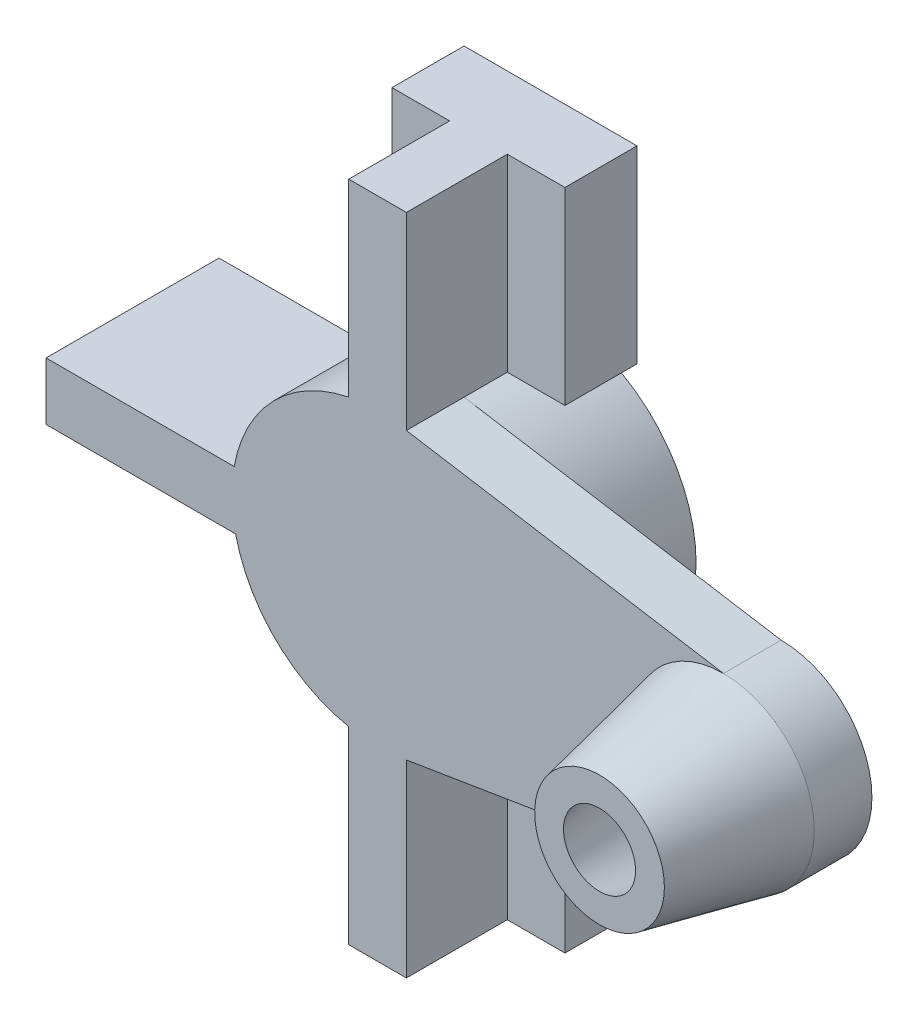
ISO-10303-21;
HEADER;
FILE_DESCRIPTION(('STEP AP214'),'2;1');
FILE_NAME('part.step','',(''),(''),'','','');
FILE_SCHEMA(('AUTOMOTIVE_DESIGN { 1 0 10303 214 1 1 1 1 }'));
ENDSEC;
DATA;
#1=APPLICATION_CONTEXT('core data for automotive mechanical design processes');
#2=APPLICATION_PROTOCOL_DEFINITION('international standard','automotive_design',2000,#1);
#3=PRODUCT_CONTEXT('',#1,'mechanical');
#4=PRODUCT('Part','Part','',(#3));
#5=PRODUCT_RELATED_PRODUCT_CATEGORY('part','',(#4));
#6=PRODUCT_DEFINITION_FORMATION('','',#4);
#7=PRODUCT_DEFINITION_CONTEXT('part definition',#1,'design');
#8=PRODUCT_DEFINITION('design','',#6,#7);
#9=PRODUCT_DEFINITION_SHAPE('','',#8);
#10=(LENGTH_UNIT() NAMED_UNIT(*) SI_UNIT(.MILLI.,.METRE.));
#11=(NAMED_UNIT(*) PLANE_ANGLE_UNIT() SI_UNIT($,.RADIAN.));
#12=(NAMED_UNIT(*) SI_UNIT($,.STERADIAN.) SOLID_ANGLE_UNIT());
#13=UNCERTAINTY_MEASURE_WITH_UNIT(LENGTH_MEASURE(1.E-05),#10,'distance_accuracy_value','');
#14=(GEOMETRIC_REPRESENTATION_CONTEXT(3) GLOBAL_UNCERTAINTY_ASSIGNED_CONTEXT((#13)) GLOBAL_UNIT_ASSIGNED_CONTEXT((#10,
#11,#12)) REPRESENTATION_CONTEXT('',''));
#15=CARTESIAN_POINT('',(0.,0.,0.));
#16=DIRECTION('',(0.,0.,1.));
#17=DIRECTION('',(1.,0.,0.));
#18=AXIS2_PLACEMENT_3D('',#15,#16,#17);
#19=CARTESIAN_POINT('',(-10.,-115.,20.));
#20=DIRECTION('',(1.,0.,0.));
#21=DIRECTION('',(0.,1.,0.));
#22=AXIS2_PLACEMENT_3D('',#19,#20,#21);
#23=PLANE('',#22);
#24=DIRECTION('',(0.,1.,0.));
#25=VECTOR('',#24,1.);
#26=CARTESIAN_POINT('',(-10.,-115.,-15.));
#27=LINE('',#26,#25);
#28=CARTESIAN_POINT('',(-10.,-115.,-15.));
#29=VERTEX_POINT('',#28);
#30=CARTESIAN_POINT('',(-10.,-49.5,-15.));
#31=VERTEX_POINT('',#30);
#32=EDGE_CURVE('E253',#29,#31,#27,.T.);
#33=ORIENTED_EDGE('',*,*,#32,.F.);
#34=DIRECTION('',(0.,0.,-1.));
#35=VECTOR('',#34,1.);
#36=CARTESIAN_POINT('',(-10.,-115.,20.));
#37=LINE('',#36,#35);
#38=CARTESIAN_POINT('',(-10.,-115.,20.));
#39=VERTEX_POINT('',#38);
#40=EDGE_CURVE('E380',#39,#29,#37,.T.);
#41=ORIENTED_EDGE('',*,*,#40,.F.);
#42=DIRECTION('',(0.,-1.,0.));
#43=VECTOR('',#42,1.);
#44=CARTESIAN_POINT('',(-10.,-115.,20.));
#45=LINE('',#44,#43);
#46=CARTESIAN_POINT('',(-9.99999999999999,-49.5,20.));
#47=VERTEX_POINT('',#46);
#48=EDGE_CURVE('E468',#47,#39,#45,.T.);
#49=ORIENTED_EDGE('',*,*,#48,.F.);
#50=DIRECTION('',(0.,0.,-1.));
#51=VECTOR('',#50,1.);
#52=CARTESIAN_POINT('',(-9.99999999999999,-49.5,20.));
#53=LINE('',#52,#51);
#54=EDGE_CURVE('E375',#47,#31,#53,.T.);
#55=ORIENTED_EDGE('',*,*,#54,.T.);
#56=EDGE_LOOP('',(#33,#41,#49,#55));
#57=FACE_BOUND('',#56,.T.);
#58=ADVANCED_FACE('F33',(#57),#23,.F.);
#59=CARTESIAN_POINT('',(10.,-115.,20.));
#60=DIRECTION('',(-1.,0.,0.));
#61=DIRECTION('',(0.,-1.,0.));
#62=AXIS2_PLACEMENT_3D('',#59,#60,#61);
#63=PLANE('',#62);
#64=DIRECTION('',(0.,-1.,0.));
#65=VECTOR('',#64,1.);
#66=CARTESIAN_POINT('',(10.,-115.,-15.));
#67=LINE('',#66,#65);
#68=CARTESIAN_POINT('',(10.,-49.5,-15.));
#69=VERTEX_POINT('',#68);
#70=CARTESIAN_POINT('',(10.,-115.,-15.));
#71=VERTEX_POINT('',#70);
#72=EDGE_CURVE('E11',#69,#71,#67,.T.);
#73=ORIENTED_EDGE('',*,*,#72,.F.);
#74=DIRECTION('',(0.,0.,1.));
#75=VECTOR('',#74,1.);
#76=CARTESIAN_POINT('',(10.,-49.5,-40.));
#77=LINE('',#76,#75);
#78=CARTESIAN_POINT('',(10.,-49.5,0.));
#79=VERTEX_POINT('',#78);
#80=EDGE_CURVE('E308',#69,#79,#77,.T.);
#81=ORIENTED_EDGE('',*,*,#80,.T.);
#82=DIRECTION('',(0.,0.,-1.));
#83=VECTOR('',#82,1.);
#84=CARTESIAN_POINT('',(10.,-49.5,20.));
#85=LINE('',#84,#83);
#86=CARTESIAN_POINT('',(10.,-49.5,20.));
#87=VERTEX_POINT('',#86);
#88=EDGE_CURVE('E361',#87,#79,#85,.T.);
#89=ORIENTED_EDGE('',*,*,#88,.F.);
#90=DIRECTION('',(0.,1.,0.));
#91=VECTOR('',#90,1.);
#92=CARTESIAN_POINT('',(10.,-115.,20.));
#93=LINE('',#92,#91);
#94=CARTESIAN_POINT('',(10.,-115.,20.));
#95=VERTEX_POINT('',#94);
#96=EDGE_CURVE('E356',#95,#87,#93,.T.);
#97=ORIENTED_EDGE('',*,*,#96,.F.);
#98=DIRECTION('',(0.,0.,-1.));
#99=VECTOR('',#98,1.);
#100=CARTESIAN_POINT('',(10.,-115.,20.));
#101=LINE('',#100,#99);
#102=EDGE_CURVE('E411',#95,#71,#101,.T.);
#103=ORIENTED_EDGE('',*,*,#102,.T.);
#104=EDGE_LOOP('',(#73,#81,#89,#97,#103));
#105=FACE_BOUND('',#104,.T.);
#106=ADVANCED_FACE('F438',(#105),#63,.F.);
#107=CARTESIAN_POINT('',(0.,0.,20.));
#108=DIRECTION('',(0.,0.,-1.));
#109=DIRECTION('',(-1.,0.,0.));
#110=AXIS2_PLACEMENT_3D('',#107,#108,#109);
#111=CYLINDRICAL_SURFACE('',#110,50.5);
#112=DIRECTION('',(0.,0.,-1.));
#113=VECTOR('',#112,1.);
#114=CARTESIAN_POINT('',(-49.2399718251623,-11.2104939524189,20.));
#115=LINE('',#114,#113);
#116=CARTESIAN_POINT('',(-49.2399718251623,-11.2104939524189,20.));
#117=VERTEX_POINT('',#116);
#118=CARTESIAN_POINT('',(-49.2399718251623,-11.2104939524189,-40.));
#119=VERTEX_POINT('',#118);
#120=EDGE_CURVE('E372',#117,#119,#115,.T.);
#121=ORIENTED_EDGE('',*,*,#120,.T.);
#122=CARTESIAN_POINT('',(0.,0.,-40.));
#123=DIRECTION('',(0.,0.,-1.));
#124=DIRECTION('',(-1.,0.,0.));
#125=AXIS2_PLACEMENT_3D('',#122,#123,#124);
#126=CIRCLE('',#125,50.5);
#127=CARTESIAN_POINT('',(-9.99999999999997,-49.5,-40.));
#128=VERTEX_POINT('',#127);
#129=EDGE_CURVE('E312',#128,#119,#126,.T.);
#130=ORIENTED_EDGE('',*,*,#129,.F.);
#131=DIRECTION('',(0.,0.,1.));
#132=VECTOR('',#131,1.);
#133=CARTESIAN_POINT('',(-9.99999999999999,-49.5,20.));
#134=LINE('',#133,#132);
#135=EDGE_CURVE('E247',#128,#31,#134,.T.);
#136=ORIENTED_EDGE('',*,*,#135,.T.);
#137=ORIENTED_EDGE('',*,*,#54,.F.);
#138=CARTESIAN_POINT('',(0.,0.,20.));
#139=DIRECTION('',(0.,0.,1.));
#140=DIRECTION('',(1.,0.,0.));
#141=AXIS2_PLACEMENT_3D('',#138,#139,#140);
#142=CIRCLE('',#141,50.5);
#143=EDGE_CURVE('E466',#117,#47,#142,.T.);
#144=ORIENTED_EDGE('',*,*,#143,.F.);
#145=EDGE_LOOP('',(#121,#130,#136,#137,#144));
#146=FACE_BOUND('',#145,.T.);
#147=ADVANCED_FACE('F444',(#146),#111,.T.);
#148=CARTESIAN_POINT('',(-49.729212576106,8.78950604758113,-40.));
#149=VERTEX_POINT('',#148);
#150=CARTESIAN_POINT('',(-10.,49.5,-40.));
#151=VERTEX_POINT('',#150);
#152=EDGE_CURVE('E316',#149,#151,#126,.T.);
#153=ORIENTED_EDGE('',*,*,#152,.F.);
#154=DIRECTION('',(0.,0.,-1.));
#155=VECTOR('',#154,1.);
#156=CARTESIAN_POINT('',(-49.729212576106,8.78950604758113,20.));
#157=LINE('',#156,#155);
#158=CARTESIAN_POINT('',(-49.729212576106,8.78950604758113,20.));
#159=VERTEX_POINT('',#158);
#160=EDGE_CURVE('E48',#159,#149,#157,.T.);
#161=ORIENTED_EDGE('',*,*,#160,.F.);
#162=CARTESIAN_POINT('',(0.,0.,20.));
#163=DIRECTION('',(0.,0.,1.));
#164=DIRECTION('',(1.,0.,0.));
#165=AXIS2_PLACEMENT_3D('',#162,#163,#164);
#166=CIRCLE('',#165,50.5);
#167=CARTESIAN_POINT('',(-9.99999999999999,49.5,20.));
#168=VERTEX_POINT('',#167);
#169=EDGE_CURVE('E487',#168,#159,#166,.T.);
#170=ORIENTED_EDGE('',*,*,#169,.F.);
#171=DIRECTION('',(0.,0.,-1.));
#172=VECTOR('',#171,1.);
#173=CARTESIAN_POINT('',(-9.99999999999999,49.5,20.));
#174=LINE('',#173,#172);
#175=CARTESIAN_POINT('',(-10.,49.5,-15.));
#176=VERTEX_POINT('',#175);
#177=EDGE_CURVE('E368',#168,#176,#174,.T.);
#178=ORIENTED_EDGE('',*,*,#177,.T.);
#179=DIRECTION('',(0.,0.,-1.));
#180=VECTOR('',#179,1.);
#181=CARTESIAN_POINT('',(-9.99999999999999,49.5,20.));
#182=LINE('',#181,#180);
#183=EDGE_CURVE('E280',#176,#151,#182,.T.);
#184=ORIENTED_EDGE('',*,*,#183,.T.);
#185=EDGE_LOOP('',(#153,#161,#170,#178,#184));
#186=FACE_BOUND('',#185,.T.);
#187=ADVANCED_FACE('F452',(#186),#111,.T.);
#188=DIRECTION('',(0.,0.,1.));
#189=VECTOR('',#188,1.);
#190=CARTESIAN_POINT('',(10.,49.5,-40.));
#191=LINE('',#190,#189);
#192=CARTESIAN_POINT('',(10.,49.5,-40.));
#193=VERTEX_POINT('',#192);
#194=CARTESIAN_POINT('',(10.,49.5,-15.));
#195=VERTEX_POINT('',#194);
#196=EDGE_CURVE('E304',#193,#195,#191,.T.);
#197=ORIENTED_EDGE('',*,*,#196,.T.);
#198=CARTESIAN_POINT('',(10.,49.5,0.));
#199=VERTEX_POINT('',#198);
#200=EDGE_CURVE('E303',#195,#199,#191,.T.);
#201=ORIENTED_EDGE('',*,*,#200,.T.);
#202=CARTESIAN_POINT('',(0.,0.,0.));
#203=DIRECTION('',(0.,0.,-1.));
#204=DIRECTION('',(-1.,0.,0.));
#205=AXIS2_PLACEMENT_3D('',#202,#203,#204);
#206=CIRCLE('',#205,50.5);
#207=EDGE_CURVE('E364',#199,#79,#206,.T.);
#208=ORIENTED_EDGE('',*,*,#207,.T.);
#209=ORIENTED_EDGE('',*,*,#80,.F.);
#210=CARTESIAN_POINT('',(10.,-49.5,-40.));
#211=VERTEX_POINT('',#210);
#212=EDGE_CURVE('E309',#211,#69,#77,.T.);
#213=ORIENTED_EDGE('',*,*,#212,.F.);
#214=EDGE_CURVE('E311',#193,#211,#126,.T.);
#215=ORIENTED_EDGE('',*,*,#214,.F.);
#216=EDGE_LOOP('',(#197,#201,#208,#209,#213,#215));
#217=FACE_BOUND('',#216,.T.);
#218=ADVANCED_FACE('F454',(#217),#111,.T.);
#219=CARTESIAN_POINT('',(120.,0.,0.));
#220=DIRECTION('',(0.,0.,1.));
#221=DIRECTION('',(1.,0.,0.));
#222=AXIS2_PLACEMENT_3D('',#219,#220,#221);
#223=PLANE('',#222);
#224=ORIENTED_EDGE('',*,*,#207,.F.);
#225=DIRECTION('',(-0.98687458289775,0.161488568110541,0.));
#226=VECTOR('',#225,1.);
#227=CARTESIAN_POINT('',(120.,31.5,0.));
#228=LINE('',#227,#226);
#229=CARTESIAN_POINT('',(120.,31.5,0.));
#230=VERTEX_POINT('',#229);
#231=EDGE_CURVE('E406',#230,#199,#228,.T.);
#232=ORIENTED_EDGE('',*,*,#231,.F.);
#233=CARTESIAN_POINT('',(120.,0.,0.));
#234=DIRECTION('',(0.,0.,1.));
#235=DIRECTION('',(1.,0.,0.));
#236=AXIS2_PLACEMENT_3D('',#233,#234,#235);
#237=CIRCLE('',#236,31.5);
#238=CARTESIAN_POINT('',(120.,-31.5,0.));
#239=VERTEX_POINT('',#238);
#240=EDGE_CURVE('E478',#239,#230,#237,.T.);
#241=ORIENTED_EDGE('',*,*,#240,.F.);
#242=DIRECTION('',(0.98687458289775,0.161488568110541,0.));
#243=VECTOR('',#242,1.);
#244=CARTESIAN_POINT('',(120.,-31.5,0.));
#245=LINE('',#244,#243);
#246=EDGE_CURVE('E329',#79,#239,#245,.T.);
#247=ORIENTED_EDGE('',*,*,#246,.F.);
#248=EDGE_LOOP('',(#224,#232,#241,#247));
#249=FACE_BOUND('',#248,.T.);
#250=ADVANCED_FACE('F564',(#249),#223,.F.);
#251=CARTESIAN_POINT('',(142.5,0.,63.));
#252=DIRECTION('',(0.,0.,1.));
#253=DIRECTION('',(1.,0.,0.));
#254=AXIS2_PLACEMENT_3D('',#251,#252,#253);
#255=PLANE('',#254);
#256=CARTESIAN_POINT('',(120.,0.,63.));
#257=DIRECTION('',(0.,0.,1.));
#258=DIRECTION('',(1.,0.,0.));
#259=AXIS2_PLACEMENT_3D('',#256,#257,#258);
#260=CIRCLE('',#259,22.5);
#261=CARTESIAN_POINT('',(142.5,0.,63.));
#262=VERTEX_POINT('',#261);
#263=EDGE_CURVE('E322',#262,#262,#260,.T.);
#264=ORIENTED_EDGE('',*,*,#263,.T.);
#265=EDGE_LOOP('',(#264));
#266=FACE_BOUND('',#265,.T.);
#267=CARTESIAN_POINT('',(120.,0.,63.));
#268=DIRECTION('',(0.,0.,-1.));
#269=DIRECTION('',(-1.,0.,0.));
#270=AXIS2_PLACEMENT_3D('',#267,#268,#269);
#271=CIRCLE('',#270,12.5);
#272=CARTESIAN_POINT('',(107.5,0.,63.));
#273=VERTEX_POINT('',#272);
#274=EDGE_CURVE('E319',#273,#273,#271,.T.);
#275=ORIENTED_EDGE('',*,*,#274,.T.);
#276=EDGE_LOOP('',(#275));
#277=FACE_BOUND('',#276,.T.);
#278=ADVANCED_FACE('F561',(#266,#277),#255,.T.);
#279=CARTESIAN_POINT('',(-10.,115.,20.));
#280=DIRECTION('',(0.,-1.,0.));
#281=DIRECTION('',(1.,0.,0.));
#282=AXIS2_PLACEMENT_3D('',#279,#280,#281);
#283=PLANE('',#282);
#284=DIRECTION('',(0.,0.,-1.));
#285=VECTOR('',#284,1.);
#286=CARTESIAN_POINT('',(10.,115.,20.));
#287=LINE('',#286,#285);
#288=CARTESIAN_POINT('',(10.,115.,20.));
#289=VERTEX_POINT('',#288);
#290=CARTESIAN_POINT('',(10.,115.,-15.));
#291=VERTEX_POINT('',#290);
#292=EDGE_CURVE('E393',#289,#291,#287,.T.);
#293=ORIENTED_EDGE('',*,*,#292,.T.);
#294=DIRECTION('',(1.,0.,0.));
#295=VECTOR('',#294,1.);
#296=CARTESIAN_POINT('',(30.,115.,-15.));
#297=LINE('',#296,#295);
#298=CARTESIAN_POINT('',(30.,115.,-15.));
#299=VERTEX_POINT('',#298);
#300=EDGE_CURVE('E259',#291,#299,#297,.T.);
#301=ORIENTED_EDGE('',*,*,#300,.T.);
#302=DIRECTION('',(0.,0.,-1.));
#303=VECTOR('',#302,1.);
#304=CARTESIAN_POINT('',(30.,115.,-15.));
#305=LINE('',#304,#303);
#306=CARTESIAN_POINT('',(30.,115.,-40.));
#307=VERTEX_POINT('',#306);
#308=EDGE_CURVE('E283',#299,#307,#305,.T.);
#309=ORIENTED_EDGE('',*,*,#308,.T.);
#310=DIRECTION('',(1.,0.,0.));
#311=VECTOR('',#310,1.);
#312=CARTESIAN_POINT('',(-10.,115.,-40.));
#313=LINE('',#312,#311);
#314=CARTESIAN_POINT('',(-30.,115.,-40.));
#315=VERTEX_POINT('',#314);
#316=EDGE_CURVE('E301',#315,#307,#313,.T.);
#317=ORIENTED_EDGE('',*,*,#316,.F.);
#318=DIRECTION('',(0.,0.,-1.));
#319=VECTOR('',#318,1.);
#320=CARTESIAN_POINT('',(-30.,115.,-15.));
#321=LINE('',#320,#319);
#322=CARTESIAN_POINT('',(-30.,115.,-15.));
#323=VERTEX_POINT('',#322);
#324=EDGE_CURVE('E270',#323,#315,#321,.T.);
#325=ORIENTED_EDGE('',*,*,#324,.F.);
#326=CARTESIAN_POINT('',(-10.,115.,-15.));
#327=VERTEX_POINT('',#326);
#328=EDGE_CURVE('E260',#323,#327,#297,.T.);
#329=ORIENTED_EDGE('',*,*,#328,.T.);
#330=DIRECTION('',(0.,0.,-1.));
#331=VECTOR('',#330,1.);
#332=CARTESIAN_POINT('',(-10.,115.,20.));
#333=LINE('',#332,#331);
#334=CARTESIAN_POINT('',(-10.,115.,20.));
#335=VERTEX_POINT('',#334);
#336=EDGE_CURVE('E335',#335,#327,#333,.T.);
#337=ORIENTED_EDGE('',*,*,#336,.F.);
#338=DIRECTION('',(-1.,0.,0.));
#339=VECTOR('',#338,1.);
#340=CARTESIAN_POINT('',(-10.,115.,20.));
#341=LINE('',#340,#339);
#342=EDGE_CURVE('E330',#289,#335,#341,.T.);
#343=ORIENTED_EDGE('',*,*,#342,.F.);
#344=EDGE_LOOP('',(#293,#301,#309,#317,#325,#329,#337,#343));
#345=FACE_BOUND('',#344,.T.);
#346=ADVANCED_FACE('F35',(#345),#283,.F.);
#347=CARTESIAN_POINT('',(-10.,115.,20.));
#348=DIRECTION('',(1.,0.,0.));
#349=DIRECTION('',(0.,1.,0.));
#350=AXIS2_PLACEMENT_3D('',#347,#348,#349);
#351=PLANE('',#350);
#352=ORIENTED_EDGE('',*,*,#336,.T.);
#353=DIRECTION('',(0.,-1.,0.));
#354=VECTOR('',#353,1.);
#355=CARTESIAN_POINT('',(-10.,115.,-15.));
#356=LINE('',#355,#354);
#357=EDGE_CURVE('E290',#327,#176,#356,.T.);
#358=ORIENTED_EDGE('',*,*,#357,.T.);
#359=ORIENTED_EDGE('',*,*,#177,.F.);
#360=DIRECTION('',(0.,-1.,0.));
#361=VECTOR('',#360,1.);
#362=CARTESIAN_POINT('',(-10.,115.,20.));
#363=LINE('',#362,#361);
#364=EDGE_CURVE('E486',#335,#168,#363,.T.);
#365=ORIENTED_EDGE('',*,*,#364,.F.);
#366=EDGE_LOOP('',(#352,#358,#359,#365));
#367=FACE_BOUND('',#366,.T.);
#368=ADVANCED_FACE('F428',(#367),#351,.F.);
#369=CARTESIAN_POINT('',(-115.,8.78950604758114,20.));
#370=DIRECTION('',(0.,-1.,0.));
#371=DIRECTION('',(0.,0.,-1.));
#372=AXIS2_PLACEMENT_3D('',#369,#370,#371);
#373=PLANE('',#372);
#374=ORIENTED_EDGE('',*,*,#160,.T.);
#375=DIRECTION('',(1.,0.,0.));
#376=VECTOR('',#375,1.);
#377=CARTESIAN_POINT('',(-115.,8.78950604758114,-40.));
#378=LINE('',#377,#376);
#379=CARTESIAN_POINT('',(-115.,8.78950604758114,-40.));
#380=VERTEX_POINT('',#379);
#381=EDGE_CURVE('E299',#380,#149,#378,.T.);
#382=ORIENTED_EDGE('',*,*,#381,.F.);
#383=DIRECTION('',(0.,0.,-1.));
#384=VECTOR('',#383,1.);
#385=CARTESIAN_POINT('',(-115.,8.78950604758114,20.));
#386=LINE('',#385,#384);
#387=CARTESIAN_POINT('',(-115.,8.78950604758114,20.));
#388=VERTEX_POINT('',#387);
#389=EDGE_CURVE('E369',#388,#380,#386,.T.);
#390=ORIENTED_EDGE('',*,*,#389,.F.);
#391=DIRECTION('',(-1.,0.,0.));
#392=VECTOR('',#391,1.);
#393=CARTESIAN_POINT('',(-115.,8.78950604758114,20.));
#394=LINE('',#393,#392);
#395=EDGE_CURVE('E470',#159,#388,#394,.T.);
#396=ORIENTED_EDGE('',*,*,#395,.F.);
#397=EDGE_LOOP('',(#374,#382,#390,#396));
#398=FACE_BOUND('',#397,.T.);
#399=ADVANCED_FACE('F426',(#398),#373,.F.);
#400=CARTESIAN_POINT('',(-115.,8.78950604758114,20.));
#401=DIRECTION('',(1.,0.,0.));
#402=DIRECTION('',(0.,0.,-1.));
#403=AXIS2_PLACEMENT_3D('',#400,#401,#402);
#404=PLANE('',#403);
#405=ORIENTED_EDGE('',*,*,#389,.T.);
#406=DIRECTION('',(0.,1.,0.));
#407=VECTOR('',#406,1.);
#408=CARTESIAN_POINT('',(-115.,-11.2104939524189,-40.));
#409=LINE('',#408,#407);
#410=CARTESIAN_POINT('',(-115.,-11.2104939524189,-40.));
#411=VERTEX_POINT('',#410);
#412=EDGE_CURVE('E296',#411,#380,#409,.T.);
#413=ORIENTED_EDGE('',*,*,#412,.F.);
#414=DIRECTION('',(0.,0.,-1.));
#415=VECTOR('',#414,1.);
#416=CARTESIAN_POINT('',(-115.,-11.2104939524189,20.));
#417=LINE('',#416,#415);
#418=CARTESIAN_POINT('',(-115.,-11.2104939524189,20.));
#419=VERTEX_POINT('',#418);
#420=EDGE_CURVE('E374',#419,#411,#417,.T.);
#421=ORIENTED_EDGE('',*,*,#420,.F.);
#422=DIRECTION('',(0.,-1.,0.));
#423=VECTOR('',#422,1.);
#424=CARTESIAN_POINT('',(-115.,8.78950604758114,20.));
#425=LINE('',#424,#423);
#426=EDGE_CURVE('E421',#388,#419,#425,.T.);
#427=ORIENTED_EDGE('',*,*,#426,.F.);
#428=EDGE_LOOP('',(#405,#413,#421,#427));
#429=FACE_BOUND('',#428,.T.);
#430=ADVANCED_FACE('F419',(#429),#404,.F.);
#431=CARTESIAN_POINT('',(-115.,-11.2104939524189,20.));
#432=DIRECTION('',(0.,1.,0.));
#433=DIRECTION('',(0.,0.,1.));
#434=AXIS2_PLACEMENT_3D('',#431,#432,#433);
#435=PLANE('',#434);
#436=ORIENTED_EDGE('',*,*,#420,.T.);
#437=DIRECTION('',(-1.,0.,0.));
#438=VECTOR('',#437,1.);
#439=CARTESIAN_POINT('',(-49.2399718251623,-11.2104939524189,-40.));
#440=LINE('',#439,#438);
#441=EDGE_CURVE('E293',#119,#411,#440,.T.);
#442=ORIENTED_EDGE('',*,*,#441,.F.);
#443=ORIENTED_EDGE('',*,*,#120,.F.);
#444=DIRECTION('',(1.,0.,0.));
#445=VECTOR('',#444,1.);
#446=CARTESIAN_POINT('',(-115.,-11.2104939524189,20.));
#447=LINE('',#446,#445);
#448=EDGE_CURVE('E463',#419,#117,#447,.T.);
#449=ORIENTED_EDGE('',*,*,#448,.F.);
#450=EDGE_LOOP('',(#436,#442,#443,#449));
#451=FACE_BOUND('',#450,.T.);
#452=ADVANCED_FACE('F434',(#451),#435,.F.);
#453=CARTESIAN_POINT('',(-10.,-115.,20.));
#454=DIRECTION('',(0.,1.,0.));
#455=DIRECTION('',(-1.,0.,0.));
#456=AXIS2_PLACEMENT_3D('',#453,#454,#455);
#457=PLANE('',#456);
#458=DIRECTION('',(-1.,0.,0.));
#459=VECTOR('',#458,1.);
#460=CARTESIAN_POINT('',(10.,-115.,-40.));
#461=LINE('',#460,#459);
#462=CARTESIAN_POINT('',(30.,-115.,-40.));
#463=VERTEX_POINT('',#462);
#464=CARTESIAN_POINT('',(-30.,-115.,-40.));
#465=VERTEX_POINT('',#464);
#466=EDGE_CURVE('E210',#463,#465,#461,.T.);
#467=ORIENTED_EDGE('',*,*,#466,.F.);
#468=DIRECTION('',(0.,0.,-1.));
#469=VECTOR('',#468,1.);
#470=CARTESIAN_POINT('',(30.,-115.,-15.));
#471=LINE('',#470,#469);
#472=CARTESIAN_POINT('',(30.,-115.,-15.));
#473=VERTEX_POINT('',#472);
#474=EDGE_CURVE('E203',#473,#463,#471,.T.);
#475=ORIENTED_EDGE('',*,*,#474,.F.);
#476=DIRECTION('',(-1.,0.,0.));
#477=VECTOR('',#476,1.);
#478=CARTESIAN_POINT('',(30.,-115.,-15.));
#479=LINE('',#478,#477);
#480=EDGE_CURVE('E207',#473,#71,#479,.T.);
#481=ORIENTED_EDGE('',*,*,#480,.T.);
#482=ORIENTED_EDGE('',*,*,#102,.F.);
#483=DIRECTION('',(1.,0.,0.));
#484=VECTOR('',#483,1.);
#485=CARTESIAN_POINT('',(-10.,-115.,20.));
#486=LINE('',#485,#484);
#487=EDGE_CURVE('E475',#39,#95,#486,.T.);
#488=ORIENTED_EDGE('',*,*,#487,.F.);
#489=ORIENTED_EDGE('',*,*,#40,.T.);
#490=CARTESIAN_POINT('',(-30.,-115.,-15.));
#491=VERTEX_POINT('',#490);
#492=EDGE_CURVE('E225',#29,#491,#479,.T.);
#493=ORIENTED_EDGE('',*,*,#492,.T.);
#494=DIRECTION('',(0.,0.,-1.));
#495=VECTOR('',#494,1.);
#496=CARTESIAN_POINT('',(-30.,-115.,-15.));
#497=LINE('',#496,#495);
#498=EDGE_CURVE('E215',#491,#465,#497,.T.);
#499=ORIENTED_EDGE('',*,*,#498,.T.);
#500=EDGE_LOOP('',(#467,#475,#481,#482,#488,#489,#493,#499));
#501=FACE_BOUND('',#500,.T.);
#502=ADVANCED_FACE('F205',(#501),#457,.F.);
#503=CARTESIAN_POINT('',(120.,-31.5,20.));
#504=DIRECTION('',(-0.161488568110541,0.98687458289775,0.));
#505=DIRECTION('',(-0.98687458289775,-0.161488568110541,0.));
#506=AXIS2_PLACEMENT_3D('',#503,#504,#505);
#507=PLANE('',#506);
#508=ORIENTED_EDGE('',*,*,#246,.T.);
#509=DIRECTION('',(0.,0.,-1.));
#510=VECTOR('',#509,1.);
#511=CARTESIAN_POINT('',(120.,-31.5,20.));
#512=LINE('',#511,#510);
#513=CARTESIAN_POINT('',(120.,-31.5,20.));
#514=VERTEX_POINT('',#513);
#515=EDGE_CURVE('E346',#514,#239,#512,.T.);
#516=ORIENTED_EDGE('',*,*,#515,.F.);
#517=DIRECTION('',(0.98687458289775,0.161488568110541,0.));
#518=VECTOR('',#517,1.);
#519=CARTESIAN_POINT('',(120.,-31.5,20.));
#520=LINE('',#519,#518);
#521=EDGE_CURVE('E352',#87,#514,#520,.T.);
#522=ORIENTED_EDGE('',*,*,#521,.F.);
#523=ORIENTED_EDGE('',*,*,#88,.T.);
#524=EDGE_LOOP('',(#508,#516,#522,#523));
#525=FACE_BOUND('',#524,.T.);
#526=ADVANCED_FACE('F460',(#525),#507,.F.);
#527=CARTESIAN_POINT('',(120.,0.,20.));
#528=DIRECTION('',(0.,0.,-1.));
#529=DIRECTION('',(-1.,0.,0.));
#530=AXIS2_PLACEMENT_3D('',#527,#528,#529);
#531=CYLINDRICAL_SURFACE('',#530,31.5);
#532=ORIENTED_EDGE('',*,*,#240,.T.);
#533=DIRECTION('',(0.,0.,-1.));
#534=VECTOR('',#533,1.);
#535=CARTESIAN_POINT('',(120.,31.5,20.));
#536=LINE('',#535,#534);
#537=CARTESIAN_POINT('',(120.,31.5,20.));
#538=VERTEX_POINT('',#537);
#539=EDGE_CURVE('E343',#538,#230,#536,.T.);
#540=ORIENTED_EDGE('',*,*,#539,.F.);
#541=CARTESIAN_POINT('',(120.,0.,20.));
#542=DIRECTION('',(0.,0.,1.));
#543=DIRECTION('',(1.,0.,0.));
#544=AXIS2_PLACEMENT_3D('',#541,#542,#543);
#545=CIRCLE('',#544,31.5);
#546=EDGE_CURVE('E340',#514,#538,#545,.T.);
#547=ORIENTED_EDGE('',*,*,#546,.F.);
#548=ORIENTED_EDGE('',*,*,#515,.T.);
#549=EDGE_LOOP('',(#532,#540,#547,#548));
#550=FACE_BOUND('',#549,.T.);
#551=ADVANCED_FACE('F576',(#550),#531,.T.);
#552=CARTESIAN_POINT('',(120.,31.5,20.));
#553=DIRECTION('',(-0.161488568110541,-0.98687458289775,0.));
#554=DIRECTION('',(0.98687458289775,-0.161488568110541,0.));
#555=AXIS2_PLACEMENT_3D('',#552,#553,#554);
#556=PLANE('',#555);
#557=ORIENTED_EDGE('',*,*,#231,.T.);
#558=DIRECTION('',(0.,0.,-1.));
#559=VECTOR('',#558,1.);
#560=CARTESIAN_POINT('',(10.,49.5,20.));
#561=LINE('',#560,#559);
#562=CARTESIAN_POINT('',(10.,49.5,20.));
#563=VERTEX_POINT('',#562);
#564=EDGE_CURVE('E347',#563,#199,#561,.T.);
#565=ORIENTED_EDGE('',*,*,#564,.F.);
#566=DIRECTION('',(-0.98687458289775,0.161488568110541,0.));
#567=VECTOR('',#566,1.);
#568=CARTESIAN_POINT('',(120.,31.5,20.));
#569=LINE('',#568,#567);
#570=EDGE_CURVE('E337',#538,#563,#569,.T.);
#571=ORIENTED_EDGE('',*,*,#570,.F.);
#572=ORIENTED_EDGE('',*,*,#539,.T.);
#573=EDGE_LOOP('',(#557,#565,#571,#572));
#574=FACE_BOUND('',#573,.T.);
#575=ADVANCED_FACE('F573',(#574),#556,.F.);
#576=CARTESIAN_POINT('',(10.,115.,20.));
#577=DIRECTION('',(-1.,0.,0.));
#578=DIRECTION('',(0.,-1.,0.));
#579=AXIS2_PLACEMENT_3D('',#576,#577,#578);
#580=PLANE('',#579);
#581=ORIENTED_EDGE('',*,*,#200,.F.);
#582=DIRECTION('',(0.,1.,0.));
#583=VECTOR('',#582,1.);
#584=CARTESIAN_POINT('',(10.,115.,-15.));
#585=LINE('',#584,#583);
#586=EDGE_CURVE('E41',#195,#291,#585,.T.);
#587=ORIENTED_EDGE('',*,*,#586,.T.);
#588=ORIENTED_EDGE('',*,*,#292,.F.);
#589=DIRECTION('',(0.,1.,0.));
#590=VECTOR('',#589,1.);
#591=CARTESIAN_POINT('',(10.,115.,20.));
#592=LINE('',#591,#590);
#593=EDGE_CURVE('E339',#563,#289,#592,.T.);
#594=ORIENTED_EDGE('',*,*,#593,.F.);
#595=ORIENTED_EDGE('',*,*,#564,.T.);
#596=EDGE_LOOP('',(#581,#587,#588,#594,#595));
#597=FACE_BOUND('',#596,.T.);
#598=ADVANCED_FACE('F391',(#597),#580,.F.);
#599=CARTESIAN_POINT('',(120.,0.,20.));
#600=DIRECTION('',(0.,0.,1.));
#601=DIRECTION('',(1.,0.,0.));
#602=AXIS2_PLACEMENT_3D('',#599,#600,#601);
#603=PLANE('',#602);
#604=CARTESIAN_POINT('',(120.,0.,20.));
#605=DIRECTION('',(0.,0.,1.));
#606=DIRECTION('',(1.,0.,0.));
#607=AXIS2_PLACEMENT_3D('',#604,#605,#606);
#608=CIRCLE('',#607,31.5);
#609=EDGE_CURVE('E325',#538,#514,#608,.T.);
#610=ORIENTED_EDGE('',*,*,#609,.F.);
#611=ORIENTED_EDGE('',*,*,#570,.T.);
#612=ORIENTED_EDGE('',*,*,#593,.T.);
#613=ORIENTED_EDGE('',*,*,#342,.T.);
#614=ORIENTED_EDGE('',*,*,#364,.T.);
#615=ORIENTED_EDGE('',*,*,#169,.T.);
#616=ORIENTED_EDGE('',*,*,#395,.T.);
#617=ORIENTED_EDGE('',*,*,#426,.T.);
#618=ORIENTED_EDGE('',*,*,#448,.T.);
#619=ORIENTED_EDGE('',*,*,#143,.T.);
#620=ORIENTED_EDGE('',*,*,#48,.T.);
#621=ORIENTED_EDGE('',*,*,#487,.T.);
#622=ORIENTED_EDGE('',*,*,#96,.T.);
#623=ORIENTED_EDGE('',*,*,#521,.T.);
#624=EDGE_LOOP('',(#610,#611,#612,#613,#614,#615,#616,#617,#618,#619,#620,#621,#622,#623));
#625=FACE_BOUND('',#624,.T.);
#626=ADVANCED_FACE('F491',(#625),#603,.T.);
#627=CARTESIAN_POINT('',(120.,0.,63.));
#628=DIRECTION('',(0.,0.,-1.));
#629=DIRECTION('',(-1.,0.,0.));
#630=AXIS2_PLACEMENT_3D('',#627,#628,#629);
#631=CONICAL_SURFACE('',#630,22.5,0.206323894029718);
#632=ORIENTED_EDGE('',*,*,#609,.T.);
#633=ORIENTED_EDGE('',*,*,#546,.T.);
#634=EDGE_LOOP('',(#632,#633));
#635=FACE_BOUND('',#634,.T.);
#636=ORIENTED_EDGE('',*,*,#263,.F.);
#637=EDGE_LOOP('',(#636));
#638=FACE_BOUND('',#637,.T.);
#639=ADVANCED_FACE('F556',(#635,#638),#631,.T.);
#640=CARTESIAN_POINT('',(142.5,0.,20.));
#641=DIRECTION('',(0.,0.,1.));
#642=DIRECTION('',(1.,0.,0.));
#643=AXIS2_PLACEMENT_3D('',#640,#641,#642);
#644=PLANE('',#643);
#645=CARTESIAN_POINT('',(120.,0.,20.));
#646=DIRECTION('',(0.,0.,-1.));
#647=DIRECTION('',(-1.,0.,0.));
#648=AXIS2_PLACEMENT_3D('',#645,#646,#647);
#649=CIRCLE('',#648,22.5);
#650=CARTESIAN_POINT('',(97.5,0.,20.));
#651=VERTEX_POINT('',#650);
#652=EDGE_CURVE('E315',#651,#651,#649,.T.);
#653=ORIENTED_EDGE('',*,*,#652,.F.);
#654=EDGE_LOOP('',(#653));
#655=FACE_BOUND('',#654,.T.);
#656=ADVANCED_FACE('F552',(#655),#644,.T.);
#657=CARTESIAN_POINT('',(120.,0.,63.));
#658=DIRECTION('',(0.,0.,-1.));
#659=DIRECTION('',(-1.,0.,0.));
#660=AXIS2_PLACEMENT_3D('',#657,#658,#659);
#661=CONICAL_SURFACE('',#660,12.5,0.228496639291862);
#662=ORIENTED_EDGE('',*,*,#652,.T.);
#663=EDGE_LOOP('',(#662));
#664=FACE_BOUND('',#663,.T.);
#665=ORIENTED_EDGE('',*,*,#274,.F.);
#666=EDGE_LOOP('',(#665));
#667=FACE_BOUND('',#666,.T.);
#668=ADVANCED_FACE('F549',(#664,#667),#661,.F.);
#669=CARTESIAN_POINT('',(0.,0.,-40.));
#670=DIRECTION('',(0.,0.,-1.));
#671=DIRECTION('',(-1.,0.,0.));
#672=AXIS2_PLACEMENT_3D('',#669,#670,#671);
#673=PLANE('',#672);
#674=ORIENTED_EDGE('',*,*,#214,.T.);
#675=DIRECTION('',(1.,0.,0.));
#676=VECTOR('',#675,1.);
#677=CARTESIAN_POINT('',(30.,-49.5,-40.));
#678=LINE('',#677,#676);
#679=CARTESIAN_POINT('',(30.,-49.5,-40.));
#680=VERTEX_POINT('',#679);
#681=EDGE_CURVE('E233',#211,#680,#678,.T.);
#682=ORIENTED_EDGE('',*,*,#681,.T.);
#683=DIRECTION('',(0.,-1.,0.));
#684=VECTOR('',#683,1.);
#685=CARTESIAN_POINT('',(30.,-49.5,-40.));
#686=LINE('',#685,#684);
#687=EDGE_CURVE('E241',#680,#463,#686,.T.);
#688=ORIENTED_EDGE('',*,*,#687,.T.);
#689=ORIENTED_EDGE('',*,*,#466,.T.);
#690=DIRECTION('',(0.,1.,0.));
#691=VECTOR('',#690,1.);
#692=CARTESIAN_POINT('',(-30.,-49.5,-40.));
#693=LINE('',#692,#691);
#694=CARTESIAN_POINT('',(-30.,-49.5,-40.));
#695=VERTEX_POINT('',#694);
#696=EDGE_CURVE('E243',#465,#695,#693,.T.);
#697=ORIENTED_EDGE('',*,*,#696,.T.);
#698=EDGE_CURVE('E231',#695,#128,#678,.T.);
#699=ORIENTED_EDGE('',*,*,#698,.T.);
#700=ORIENTED_EDGE('',*,*,#129,.T.);
#701=ORIENTED_EDGE('',*,*,#441,.T.);
#702=ORIENTED_EDGE('',*,*,#412,.T.);
#703=ORIENTED_EDGE('',*,*,#381,.T.);
#704=ORIENTED_EDGE('',*,*,#152,.T.);
#705=DIRECTION('',(-1.,0.,0.));
#706=VECTOR('',#705,1.);
#707=CARTESIAN_POINT('',(30.,49.5,-40.));
#708=LINE('',#707,#706);
#709=CARTESIAN_POINT('',(-30.,49.5,-40.));
#710=VERTEX_POINT('',#709);
#711=EDGE_CURVE('E275',#151,#710,#708,.T.);
#712=ORIENTED_EDGE('',*,*,#711,.T.);
#713=DIRECTION('',(0.,1.,0.));
#714=VECTOR('',#713,1.);
#715=CARTESIAN_POINT('',(-30.,49.5,-40.));
#716=LINE('',#715,#714);
#717=EDGE_CURVE('E255',#710,#315,#716,.T.);
#718=ORIENTED_EDGE('',*,*,#717,.T.);
#719=ORIENTED_EDGE('',*,*,#316,.T.);
#720=DIRECTION('',(0.,-1.,0.));
#721=VECTOR('',#720,1.);
#722=CARTESIAN_POINT('',(30.,49.5,-40.));
#723=LINE('',#722,#721);
#724=CARTESIAN_POINT('',(30.,49.5,-40.));
#725=VERTEX_POINT('',#724);
#726=EDGE_CURVE('E273',#307,#725,#723,.T.);
#727=ORIENTED_EDGE('',*,*,#726,.T.);
#728=EDGE_CURVE('E56',#725,#193,#708,.T.);
#729=ORIENTED_EDGE('',*,*,#728,.T.);
#730=EDGE_LOOP('',(#674,#682,#688,#689,#697,#699,#700,#701,#702,#703,#704,#712,#718,#719,#727,#729));
#731=FACE_BOUND('',#730,.T.);
#732=ADVANCED_FACE('F422',(#731),#673,.T.);
#733=CARTESIAN_POINT('',(30.,49.5,-15.));
#734=DIRECTION('',(1.,0.,0.));
#735=DIRECTION('',(0.,0.,-1.));
#736=AXIS2_PLACEMENT_3D('',#733,#734,#735);
#737=PLANE('',#736);
#738=ORIENTED_EDGE('',*,*,#726,.F.);
#739=ORIENTED_EDGE('',*,*,#308,.F.);
#740=DIRECTION('',(0.,-1.,0.));
#741=VECTOR('',#740,1.);
#742=CARTESIAN_POINT('',(30.,49.5,-15.));
#743=LINE('',#742,#741);
#744=CARTESIAN_POINT('',(30.,49.5,-15.));
#745=VERTEX_POINT('',#744);
#746=EDGE_CURVE('E263',#299,#745,#743,.T.);
#747=ORIENTED_EDGE('',*,*,#746,.T.);
#748=DIRECTION('',(0.,0.,-1.));
#749=VECTOR('',#748,1.);
#750=CARTESIAN_POINT('',(30.,49.5,-15.));
#751=LINE('',#750,#749);
#752=EDGE_CURVE('E281',#745,#725,#751,.T.);
#753=ORIENTED_EDGE('',*,*,#752,.T.);
#754=EDGE_LOOP('',(#738,#739,#747,#753));
#755=FACE_BOUND('',#754,.T.);
#756=ADVANCED_FACE('F540',(#755),#737,.T.);
#757=CARTESIAN_POINT('',(0.,0.,-15.));
#758=DIRECTION('',(0.,0.,1.));
#759=DIRECTION('',(1.,0.,0.));
#760=AXIS2_PLACEMENT_3D('',#757,#758,#759);
#761=PLANE('',#760);
#762=ORIENTED_EDGE('',*,*,#586,.F.);
#763=DIRECTION('',(-1.,0.,0.));
#764=VECTOR('',#763,1.);
#765=CARTESIAN_POINT('',(30.,49.5,-15.));
#766=LINE('',#765,#764);
#767=EDGE_CURVE('E267',#745,#195,#766,.T.);
#768=ORIENTED_EDGE('',*,*,#767,.F.);
#769=ORIENTED_EDGE('',*,*,#746,.F.);
#770=ORIENTED_EDGE('',*,*,#300,.F.);
#771=EDGE_LOOP('',(#762,#768,#769,#770));
#772=FACE_BOUND('',#771,.T.);
#773=ADVANCED_FACE('F536',(#772),#761,.T.);
#774=CARTESIAN_POINT('',(30.,49.5,-15.));
#775=DIRECTION('',(0.,-1.,0.));
#776=DIRECTION('',(0.,0.,-1.));
#777=AXIS2_PLACEMENT_3D('',#774,#775,#776);
#778=PLANE('',#777);
#779=ORIENTED_EDGE('',*,*,#196,.F.);
#780=ORIENTED_EDGE('',*,*,#728,.F.);
#781=ORIENTED_EDGE('',*,*,#752,.F.);
#782=ORIENTED_EDGE('',*,*,#767,.T.);
#783=EDGE_LOOP('',(#779,#780,#781,#782));
#784=FACE_BOUND('',#783,.T.);
#785=ADVANCED_FACE('F534',(#784),#778,.T.);
#786=ORIENTED_EDGE('',*,*,#357,.F.);
#787=ORIENTED_EDGE('',*,*,#328,.F.);
#788=DIRECTION('',(0.,1.,0.));
#789=VECTOR('',#788,1.);
#790=CARTESIAN_POINT('',(-30.,49.5,-15.));
#791=LINE('',#790,#789);
#792=CARTESIAN_POINT('',(-30.,49.5,-15.));
#793=VERTEX_POINT('',#792);
#794=EDGE_CURVE('E256',#793,#323,#791,.T.);
#795=ORIENTED_EDGE('',*,*,#794,.F.);
#796=EDGE_CURVE('E266',#176,#793,#766,.T.);
#797=ORIENTED_EDGE('',*,*,#796,.F.);
#798=EDGE_LOOP('',(#786,#787,#795,#797));
#799=FACE_BOUND('',#798,.T.);
#800=ADVANCED_FACE('F530',(#799),#761,.T.);
#801=ORIENTED_EDGE('',*,*,#183,.F.);
#802=ORIENTED_EDGE('',*,*,#796,.T.);
#803=DIRECTION('',(0.,0.,-1.));
#804=VECTOR('',#803,1.);
#805=CARTESIAN_POINT('',(-30.,49.5,-15.));
#806=LINE('',#805,#804);
#807=EDGE_CURVE('E277',#793,#710,#806,.T.);
#808=ORIENTED_EDGE('',*,*,#807,.T.);
#809=ORIENTED_EDGE('',*,*,#711,.F.);
#810=EDGE_LOOP('',(#801,#802,#808,#809));
#811=FACE_BOUND('',#810,.T.);
#812=ADVANCED_FACE('F533',(#811),#778,.T.);
#813=CARTESIAN_POINT('',(-30.,49.5,-15.));
#814=DIRECTION('',(-1.,0.,0.));
#815=DIRECTION('',(0.,0.,1.));
#816=AXIS2_PLACEMENT_3D('',#813,#814,#815);
#817=PLANE('',#816);
#818=ORIENTED_EDGE('',*,*,#717,.F.);
#819=ORIENTED_EDGE('',*,*,#807,.F.);
#820=ORIENTED_EDGE('',*,*,#794,.T.);
#821=ORIENTED_EDGE('',*,*,#324,.T.);
#822=EDGE_LOOP('',(#818,#819,#820,#821));
#823=FACE_BOUND('',#822,.T.);
#824=ADVANCED_FACE('F529',(#823),#817,.T.);
#825=CARTESIAN_POINT('',(30.,-49.5,-15.));
#826=DIRECTION('',(1.,0.,0.));
#827=DIRECTION('',(0.,0.,-1.));
#828=AXIS2_PLACEMENT_3D('',#825,#826,#827);
#829=PLANE('',#828);
#830=ORIENTED_EDGE('',*,*,#687,.F.);
#831=DIRECTION('',(0.,0.,-1.));
#832=VECTOR('',#831,1.);
#833=CARTESIAN_POINT('',(30.,-49.5,-15.));
#834=LINE('',#833,#832);
#835=CARTESIAN_POINT('',(30.,-49.5,-15.));
#836=VERTEX_POINT('',#835);
#837=EDGE_CURVE('E230',#836,#680,#834,.T.);
#838=ORIENTED_EDGE('',*,*,#837,.F.);
#839=DIRECTION('',(0.,-1.,0.));
#840=VECTOR('',#839,1.);
#841=CARTESIAN_POINT('',(30.,-49.5,-15.));
#842=LINE('',#841,#840);
#843=EDGE_CURVE('E222',#836,#473,#842,.T.);
#844=ORIENTED_EDGE('',*,*,#843,.T.);
#845=ORIENTED_EDGE('',*,*,#474,.T.);
#846=EDGE_LOOP('',(#830,#838,#844,#845));
#847=FACE_BOUND('',#846,.T.);
#848=ADVANCED_FACE('F228',(#847),#829,.T.);
#849=CARTESIAN_POINT('',(0.,0.,-15.));
#850=DIRECTION('',(0.,0.,-1.));
#851=DIRECTION('',(-1.,0.,0.));
#852=AXIS2_PLACEMENT_3D('',#849,#850,#851);
#853=PLANE('',#852);
#854=DIRECTION('',(1.,0.,0.));
#855=VECTOR('',#854,1.);
#856=CARTESIAN_POINT('',(30.,-49.5,-15.));
#857=LINE('',#856,#855);
#858=EDGE_CURVE('E238',#69,#836,#857,.T.);
#859=ORIENTED_EDGE('',*,*,#858,.F.);
#860=ORIENTED_EDGE('',*,*,#72,.T.);
#861=ORIENTED_EDGE('',*,*,#480,.F.);
#862=ORIENTED_EDGE('',*,*,#843,.F.);
#863=EDGE_LOOP('',(#859,#860,#861,#862));
#864=FACE_BOUND('',#863,.T.);
#865=ADVANCED_FACE('F221',(#864),#853,.F.);
#866=CARTESIAN_POINT('',(30.,-49.5,-15.));
#867=DIRECTION('',(0.,1.,0.));
#868=DIRECTION('',(0.,0.,1.));
#869=AXIS2_PLACEMENT_3D('',#866,#867,#868);
#870=PLANE('',#869);
#871=ORIENTED_EDGE('',*,*,#212,.T.);
#872=ORIENTED_EDGE('',*,*,#858,.T.);
#873=ORIENTED_EDGE('',*,*,#837,.T.);
#874=ORIENTED_EDGE('',*,*,#681,.F.);
#875=EDGE_LOOP('',(#871,#872,#873,#874));
#876=FACE_BOUND('',#875,.T.);
#877=ADVANCED_FACE('F499',(#876),#870,.T.);
#878=ORIENTED_EDGE('',*,*,#492,.F.);
#879=ORIENTED_EDGE('',*,*,#32,.T.);
#880=CARTESIAN_POINT('',(-30.,-49.5,-15.));
#881=VERTEX_POINT('',#880);
#882=EDGE_CURVE('E216',#881,#31,#857,.T.);
#883=ORIENTED_EDGE('',*,*,#882,.F.);
#884=DIRECTION('',(0.,1.,0.));
#885=VECTOR('',#884,1.);
#886=CARTESIAN_POINT('',(-30.,-49.5,-15.));
#887=LINE('',#886,#885);
#888=EDGE_CURVE('E224',#491,#881,#887,.T.);
#889=ORIENTED_EDGE('',*,*,#888,.F.);
#890=EDGE_LOOP('',(#878,#879,#883,#889));
#891=FACE_BOUND('',#890,.T.);
#892=ADVANCED_FACE('F508',(#891),#853,.F.);
#893=ORIENTED_EDGE('',*,*,#135,.F.);
#894=ORIENTED_EDGE('',*,*,#698,.F.);
#895=DIRECTION('',(0.,0.,-1.));
#896=VECTOR('',#895,1.);
#897=CARTESIAN_POINT('',(-30.,-49.5,-15.));
#898=LINE('',#897,#896);
#899=EDGE_CURVE('E248',#881,#695,#898,.T.);
#900=ORIENTED_EDGE('',*,*,#899,.F.);
#901=ORIENTED_EDGE('',*,*,#882,.T.);
#902=EDGE_LOOP('',(#893,#894,#900,#901));
#903=FACE_BOUND('',#902,.T.);
#904=ADVANCED_FACE('F512',(#903),#870,.T.);
#905=CARTESIAN_POINT('',(-30.,-49.5,-15.));
#906=DIRECTION('',(-1.,0.,0.));
#907=DIRECTION('',(0.,0.,1.));
#908=AXIS2_PLACEMENT_3D('',#905,#906,#907);
#909=PLANE('',#908);
#910=ORIENTED_EDGE('',*,*,#696,.F.);
#911=ORIENTED_EDGE('',*,*,#498,.F.);
#912=ORIENTED_EDGE('',*,*,#888,.T.);
#913=ORIENTED_EDGE('',*,*,#899,.T.);
#914=EDGE_LOOP('',(#910,#911,#912,#913));
#915=FACE_BOUND('',#914,.T.);
#916=ADVANCED_FACE('F518',(#915),#909,.T.);
#917=CLOSED_SHELL('',(#58,#106,#147,#187,#218,#250,#278,#346,#368,#399,#430,#452,#502,#526,#551,
#575,#598,#626,#639,#656,#668,#732,#756,#773,#785,#800,#812,#824,#848,#865,#877,#892,#904,#916));
#918=MANIFOLD_SOLID_BREP('B2',#917);
#919=ADVANCED_BREP_SHAPE_REPRESENTATION('',(#18,#918),#14);
#920=SHAPE_DEFINITION_REPRESENTATION(#9,#919);
ENDSEC;
END-ISO-10303-21;
